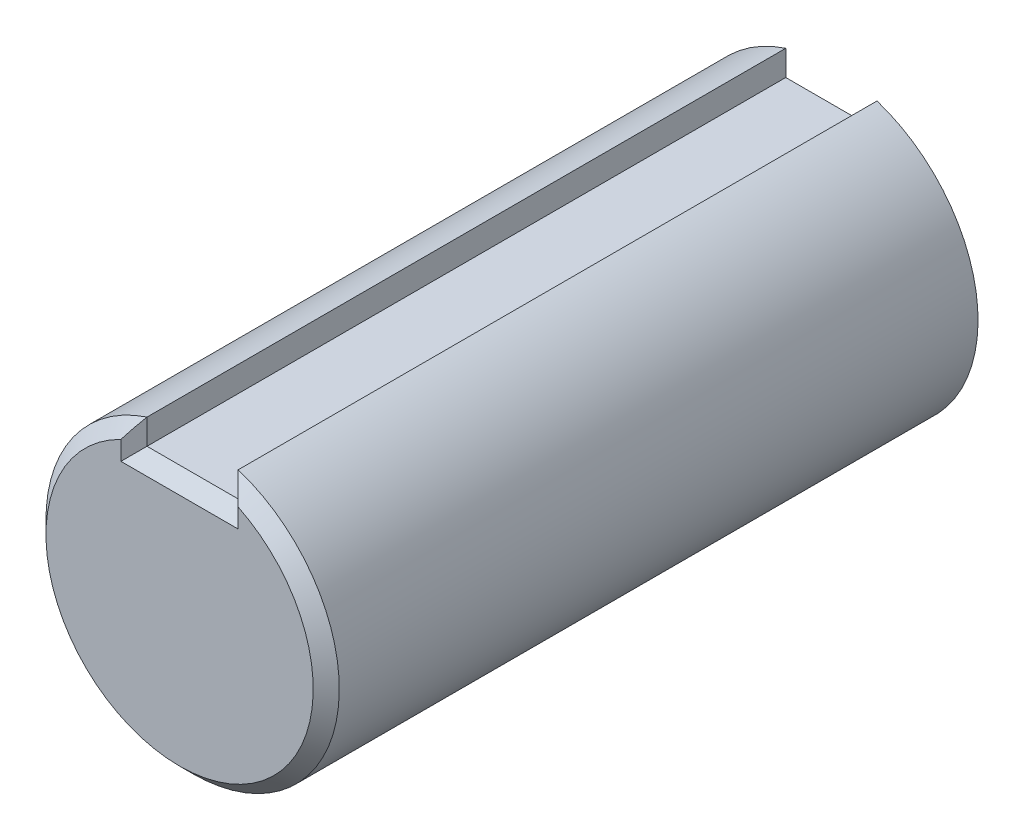
ISO-10303-21;
HEADER;
FILE_DESCRIPTION(('STEP AP214'),'2;1');
FILE_NAME('part.step','',(''),(''),'','','');
FILE_SCHEMA(('AUTOMOTIVE_DESIGN { 1 0 10303 214 1 1 1 1 }'));
ENDSEC;
DATA;
#1=APPLICATION_CONTEXT('core data for automotive mechanical design processes');
#2=APPLICATION_PROTOCOL_DEFINITION('international standard','automotive_design',2000,#1);
#3=PRODUCT_CONTEXT('',#1,'mechanical');
#4=PRODUCT('Part','Part','',(#3));
#5=PRODUCT_RELATED_PRODUCT_CATEGORY('part','',(#4));
#6=PRODUCT_DEFINITION_FORMATION('','',#4);
#7=PRODUCT_DEFINITION_CONTEXT('part definition',#1,'design');
#8=PRODUCT_DEFINITION('design','',#6,#7);
#9=PRODUCT_DEFINITION_SHAPE('','',#8);
#10=(LENGTH_UNIT() NAMED_UNIT(*) SI_UNIT(.MILLI.,.METRE.));
#11=(NAMED_UNIT(*) PLANE_ANGLE_UNIT() SI_UNIT($,.RADIAN.));
#12=(NAMED_UNIT(*) SI_UNIT($,.STERADIAN.) SOLID_ANGLE_UNIT());
#13=UNCERTAINTY_MEASURE_WITH_UNIT(LENGTH_MEASURE(1.E-05),#10,'distance_accuracy_value','');
#14=(GEOMETRIC_REPRESENTATION_CONTEXT(3) GLOBAL_UNCERTAINTY_ASSIGNED_CONTEXT((#13)) GLOBAL_UNIT_ASSIGNED_CONTEXT((#10,
#11,#12)) REPRESENTATION_CONTEXT('',''));
#15=CARTESIAN_POINT('',(0.,0.,0.));
#16=DIRECTION('',(0.,0.,1.));
#17=DIRECTION('',(1.,0.,0.));
#18=AXIS2_PLACEMENT_3D('',#15,#16,#17);
#19=CARTESIAN_POINT('',(0.,0.,100.));
#20=DIRECTION('',(0.,0.,-1.));
#21=DIRECTION('',(-1.,0.,0.));
#22=AXIS2_PLACEMENT_3D('',#19,#20,#21);
#23=CYLINDRICAL_SURFACE('',#22,22.5);
#24=DIRECTION('',(0.,0.,-1.));
#25=VECTOR('',#24,1.);
#26=CARTESIAN_POINT('',(7.,21.3834047803431,100.));
#27=LINE('',#26,#25);
#28=CARTESIAN_POINT('',(7.,21.3834047803431,0.));
#29=VERTEX_POINT('',#28);
#30=CARTESIAN_POINT('',(7.,21.3834047803431,98.));
#31=VERTEX_POINT('',#30);
#32=EDGE_CURVE('E116',#29,#31,#27,.F.);
#33=ORIENTED_EDGE('',*,*,#32,.T.);
#34=CARTESIAN_POINT('',(0.,0.,98.));
#35=DIRECTION('',(0.,0.,1.));
#36=DIRECTION('',(1.,0.,0.));
#37=AXIS2_PLACEMENT_3D('',#34,#35,#36);
#38=CIRCLE('',#37,22.5);
#39=CARTESIAN_POINT('',(-7.,21.3834047803431,98.));
#40=VERTEX_POINT('',#39);
#41=EDGE_CURVE('E153',#31,#40,#38,.F.);
#42=ORIENTED_EDGE('',*,*,#41,.T.);
#43=DIRECTION('',(0.,0.,-1.));
#44=VECTOR('',#43,1.);
#45=CARTESIAN_POINT('',(-7.,21.3834047803431,100.));
#46=LINE('',#45,#44);
#47=CARTESIAN_POINT('',(-7.,21.3834047803431,0.));
#48=VERTEX_POINT('',#47);
#49=EDGE_CURVE('E109',#40,#48,#46,.T.);
#50=ORIENTED_EDGE('',*,*,#49,.T.);
#51=CARTESIAN_POINT('',(0.,0.,0.));
#52=DIRECTION('',(0.,0.,1.));
#53=DIRECTION('',(1.,0.,0.));
#54=AXIS2_PLACEMENT_3D('',#51,#52,#53);
#55=CIRCLE('',#54,22.5);
#56=EDGE_CURVE('E135',#48,#29,#55,.T.);
#57=ORIENTED_EDGE('',*,*,#56,.T.);
#58=EDGE_LOOP('',(#33,#42,#50,#57));
#59=FACE_BOUND('',#58,.T.);
#60=ADVANCED_FACE('F47',(#59),#23,.T.);
#61=CARTESIAN_POINT('',(0.,0.,100.));
#62=DIRECTION('',(0.,0.,1.));
#63=DIRECTION('',(1.,0.,0.));
#64=AXIS2_PLACEMENT_3D('',#61,#62,#63);
#65=PLANE('',#64);
#66=DIRECTION('',(0.,1.,0.));
#67=VECTOR('',#66,1.);
#68=CARTESIAN_POINT('',(-8.99999999999999,21.3834047803431,100.));
#69=LINE('',#68,#67);
#70=CARTESIAN_POINT('',(-8.99999999999998,15.5,100.));
#71=VERTEX_POINT('',#70);
#72=CARTESIAN_POINT('',(-8.99999999999999,18.4187404563939,100.));
#73=VERTEX_POINT('',#72);
#74=EDGE_CURVE('E146',#71,#73,#69,.T.);
#75=ORIENTED_EDGE('',*,*,#74,.T.);
#76=CARTESIAN_POINT('',(0.,0.,100.));
#77=DIRECTION('',(0.,0.,1.));
#78=DIRECTION('',(1.,0.,0.));
#79=AXIS2_PLACEMENT_3D('',#76,#77,#78);
#80=CIRCLE('',#79,20.5);
#81=CARTESIAN_POINT('',(8.99999999999999,18.4187404563939,100.));
#82=VERTEX_POINT('',#81);
#83=EDGE_CURVE('E149',#73,#82,#80,.T.);
#84=ORIENTED_EDGE('',*,*,#83,.T.);
#85=DIRECTION('',(0.,-1.,0.));
#86=VECTOR('',#85,1.);
#87=CARTESIAN_POINT('',(8.99999999999999,17.5,100.));
#88=LINE('',#87,#86);
#89=CARTESIAN_POINT('',(8.99999999999999,15.5,100.));
#90=VERTEX_POINT('',#89);
#91=EDGE_CURVE('E140',#82,#90,#88,.T.);
#92=ORIENTED_EDGE('',*,*,#91,.T.);
#93=DIRECTION('',(-1.,0.,0.));
#94=VECTOR('',#93,1.);
#95=CARTESIAN_POINT('',(-7.,15.5,100.));
#96=LINE('',#95,#94);
#97=EDGE_CURVE('E143',#90,#71,#96,.T.);
#98=ORIENTED_EDGE('',*,*,#97,.T.);
#99=EDGE_LOOP('',(#75,#84,#92,#98));
#100=FACE_BOUND('',#99,.T.);
#101=ADVANCED_FACE('F202',(#100),#65,.T.);
#102=CARTESIAN_POINT('',(0.,0.,0.));
#103=DIRECTION('',(0.,0.,1.));
#104=DIRECTION('',(1.,0.,0.));
#105=AXIS2_PLACEMENT_3D('',#102,#103,#104);
#106=PLANE('',#105);
#107=DIRECTION('',(1.,0.,0.));
#108=VECTOR('',#107,1.);
#109=CARTESIAN_POINT('',(-7.,17.5,0.));
#110=LINE('',#109,#108);
#111=CARTESIAN_POINT('',(-7.,17.5,0.));
#112=VERTEX_POINT('',#111);
#113=CARTESIAN_POINT('',(7.,17.5,0.));
#114=VERTEX_POINT('',#113);
#115=EDGE_CURVE('E105',#112,#114,#110,.T.);
#116=ORIENTED_EDGE('',*,*,#115,.T.);
#117=DIRECTION('',(0.,1.,0.));
#118=VECTOR('',#117,1.);
#119=CARTESIAN_POINT('',(7.,26.3042375788311,0.));
#120=LINE('',#119,#118);
#121=EDGE_CURVE('E113',#114,#29,#120,.T.);
#122=ORIENTED_EDGE('',*,*,#121,.T.);
#123=ORIENTED_EDGE('',*,*,#56,.F.);
#124=DIRECTION('',(0.,-1.,0.));
#125=VECTOR('',#124,1.);
#126=CARTESIAN_POINT('',(-6.99999999999999,0.,0.));
#127=LINE('',#126,#125);
#128=EDGE_CURVE('E125',#48,#112,#127,.T.);
#129=ORIENTED_EDGE('',*,*,#128,.T.);
#130=EDGE_LOOP('',(#116,#122,#123,#129));
#131=FACE_BOUND('',#130,.T.);
#132=ADVANCED_FACE('F123',(#131),#106,.F.);
#133=CARTESIAN_POINT('',(7.,26.3042375788311,0.));
#134=DIRECTION('',(1.,0.,0.));
#135=DIRECTION('',(0.,1.,0.));
#136=AXIS2_PLACEMENT_3D('',#133,#134,#135);
#137=PLANE('',#136);
#138=DIRECTION('',(0.,0.,1.));
#139=VECTOR('',#138,1.);
#140=CARTESIAN_POINT('',(7.,17.5,0.));
#141=LINE('',#140,#139);
#142=CARTESIAN_POINT('',(7.,17.5,98.));
#143=VERTEX_POINT('',#142);
#144=EDGE_CURVE('E101',#114,#143,#141,.T.);
#145=ORIENTED_EDGE('',*,*,#144,.T.);
#146=DIRECTION('',(0.,1.,0.));
#147=VECTOR('',#146,1.);
#148=CARTESIAN_POINT('',(7.,21.3834047803431,98.));
#149=LINE('',#148,#147);
#150=EDGE_CURVE('E11',#143,#31,#149,.T.);
#151=ORIENTED_EDGE('',*,*,#150,.T.);
#152=ORIENTED_EDGE('',*,*,#32,.F.);
#153=ORIENTED_EDGE('',*,*,#121,.F.);
#154=EDGE_LOOP('',(#145,#151,#152,#153));
#155=FACE_BOUND('',#154,.T.);
#156=ADVANCED_FACE('F114',(#155),#137,.F.);
#157=CARTESIAN_POINT('',(-7.,26.3042375788311,0.));
#158=DIRECTION('',(-1.,0.,0.));
#159=DIRECTION('',(0.,-1.,0.));
#160=AXIS2_PLACEMENT_3D('',#157,#158,#159);
#161=PLANE('',#160);
#162=ORIENTED_EDGE('',*,*,#49,.F.);
#163=DIRECTION('',(0.,-1.,0.));
#164=VECTOR('',#163,1.);
#165=CARTESIAN_POINT('',(-7.,17.5,98.));
#166=LINE('',#165,#164);
#167=CARTESIAN_POINT('',(-7.,17.5,98.));
#168=VERTEX_POINT('',#167);
#169=EDGE_CURVE('E73',#40,#168,#166,.T.);
#170=ORIENTED_EDGE('',*,*,#169,.T.);
#171=DIRECTION('',(0.,0.,1.));
#172=VECTOR('',#171,1.);
#173=CARTESIAN_POINT('',(-7.,17.5,0.));
#174=LINE('',#173,#172);
#175=EDGE_CURVE('E110',#112,#168,#174,.T.);
#176=ORIENTED_EDGE('',*,*,#175,.F.);
#177=ORIENTED_EDGE('',*,*,#128,.F.);
#178=EDGE_LOOP('',(#162,#170,#176,#177));
#179=FACE_BOUND('',#178,.T.);
#180=ADVANCED_FACE('F214',(#179),#161,.F.);
#181=CARTESIAN_POINT('',(-7.,17.5,0.));
#182=DIRECTION('',(0.,-1.,0.));
#183=DIRECTION('',(0.,0.,-1.));
#184=AXIS2_PLACEMENT_3D('',#181,#182,#183);
#185=PLANE('',#184);
#186=ORIENTED_EDGE('',*,*,#175,.T.);
#187=DIRECTION('',(1.,0.,0.));
#188=VECTOR('',#187,1.);
#189=CARTESIAN_POINT('',(7.,17.5,98.));
#190=LINE('',#189,#188);
#191=EDGE_CURVE('E58',#168,#143,#190,.T.);
#192=ORIENTED_EDGE('',*,*,#191,.T.);
#193=ORIENTED_EDGE('',*,*,#144,.F.);
#194=ORIENTED_EDGE('',*,*,#115,.F.);
#195=EDGE_LOOP('',(#186,#192,#193,#194));
#196=FACE_BOUND('',#195,.T.);
#197=ADVANCED_FACE('F103',(#196),#185,.F.);
#198=CARTESIAN_POINT('',(-7.,17.5,98.));
#199=DIRECTION('',(0.,0.707106781186545,0.70710678118655));
#200=DIRECTION('',(-1.,0.,0.));
#201=AXIS2_PLACEMENT_3D('',#198,#199,#200);
#202=PLANE('',#201);
#203=DIRECTION('',(0.577350269189627,-0.577350269189627,0.577350269189623));
#204=VECTOR('',#203,1.);
#205=CARTESIAN_POINT('',(2.33333333333332,22.1666666666667,93.3333333333334));
#206=LINE('',#205,#204);
#207=EDGE_CURVE('E281',#143,#90,#206,.T.);
#208=ORIENTED_EDGE('',*,*,#207,.F.);
#209=ORIENTED_EDGE('',*,*,#191,.F.);
#210=DIRECTION('',(-0.577350269189627,-0.577350269189627,0.577350269189623));
#211=VECTOR('',#210,1.);
#212=CARTESIAN_POINT('',(-4.06525414038963,20.4347458596104,95.0652541403897));
#213=LINE('',#212,#211);
#214=EDGE_CURVE('E52',#71,#168,#213,.F.);
#215=ORIENTED_EDGE('',*,*,#214,.F.);
#216=ORIENTED_EDGE('',*,*,#97,.F.);
#217=EDGE_LOOP('',(#208,#209,#215,#216));
#218=FACE_BOUND('',#217,.T.);
#219=ADVANCED_FACE('F50',(#218),#202,.T.);
#220=CARTESIAN_POINT('',(-7.,26.3042375788311,98.));
#221=DIRECTION('',(0.707106781186545,0.,0.70710678118655));
#222=DIRECTION('',(0.,1.,0.));
#223=AXIS2_PLACEMENT_3D('',#220,#221,#222);
#224=PLANE('',#223);
#225=ORIENTED_EDGE('',*,*,#214,.T.);
#226=ORIENTED_EDGE('',*,*,#169,.F.);
#227=CARTESIAN_POINT('',(-7.,21.3834047803431,98.));
#228=CARTESIAN_POINT('',(-7.1728939886494,21.1448800837476,98.1728939886494));
#229=CARTESIAN_POINT('',(-7.34438346241136,20.904311132692,98.3443834624114));
#230=CARTESIAN_POINT('',(-7.68427902624381,20.4190215785597,98.6842790262438));
#231=CARTESIAN_POINT('',(-7.85268616174064,20.1743024394521,98.8526861617407));
#232=CARTESIAN_POINT('',(-8.18626943925745,19.6804744270975,99.1862694392575));
#233=CARTESIAN_POINT('',(-8.3514454471655,19.431365372454,99.3514454471655));
#234=CARTESIAN_POINT('',(-8.67837038920784,18.9285320638295,99.6783703892079));
#235=CARTESIAN_POINT('',(-8.84011811828094,18.6748062434148,99.840118118281));
#236=CARTESIAN_POINT('',(-8.99999999999998,18.4187404563939,100.));
#237=B_SPLINE_CURVE_WITH_KNOTS('',3,(#227,#228,#229,#230,#231,#232,#233,#234,#235,#236),
.UNSPECIFIED.,.F.,.F.,(4,2,2,2,4),(0.,1.02474416870168,2.04913408505375,3.07356643013604,
4.09835308979688),.UNSPECIFIED.);
#238=EDGE_CURVE('E170',#73,#40,#237,.F.);
#239=ORIENTED_EDGE('',*,*,#238,.F.);
#240=ORIENTED_EDGE('',*,*,#74,.F.);
#241=EDGE_LOOP('',(#225,#226,#239,#240));
#242=FACE_BOUND('',#241,.T.);
#243=ADVANCED_FACE('F187',(#242),#224,.T.);
#244=CARTESIAN_POINT('',(7.,26.3042375788311,98.));
#245=DIRECTION('',(-0.707106781186545,0.,0.70710678118655));
#246=DIRECTION('',(0.,-1.,0.));
#247=AXIS2_PLACEMENT_3D('',#244,#245,#246);
#248=PLANE('',#247);
#249=ORIENTED_EDGE('',*,*,#207,.T.);
#250=ORIENTED_EDGE('',*,*,#91,.F.);
#251=CARTESIAN_POINT('',(8.99999999999999,18.4187404563939,100.));
#252=CARTESIAN_POINT('',(8.84011811828094,18.6748062434148,99.8401181182809));
#253=CARTESIAN_POINT('',(8.67837038920784,18.9285320638295,99.6783703892079));
#254=CARTESIAN_POINT('',(8.35144544716551,19.431365372454,99.3514454471655));
#255=CARTESIAN_POINT('',(8.18626943925746,19.6804744270975,99.1862694392575));
#256=CARTESIAN_POINT('',(7.85268616174065,20.1743024394521,98.8526861617407));
#257=CARTESIAN_POINT('',(7.68427902624382,20.4190215785597,98.6842790262439));
#258=CARTESIAN_POINT('',(7.34438346241137,20.9043111326919,98.3443834624114));
#259=CARTESIAN_POINT('',(7.17289398864941,21.1448800837476,98.1728939886494));
#260=CARTESIAN_POINT('',(7.,21.3834047803431,98.));
#261=B_SPLINE_CURVE_WITH_KNOTS('',3,(#251,#252,#253,#254,#255,#256,#257,#258,#259,#260),
.UNSPECIFIED.,.F.,.F.,(4,2,2,2,4),(0.,1.02478665966085,2.04921900474312,3.07360892109519,
4.09835308979688),.UNSPECIFIED.);
#262=EDGE_CURVE('E161',#31,#82,#261,.F.);
#263=ORIENTED_EDGE('',*,*,#262,.F.);
#264=ORIENTED_EDGE('',*,*,#150,.F.);
#265=EDGE_LOOP('',(#249,#250,#263,#264));
#266=FACE_BOUND('',#265,.T.);
#267=ADVANCED_FACE('F176',(#266),#248,.T.);
#268=CARTESIAN_POINT('',(0.,0.,100.));
#269=DIRECTION('',(0.,0.,-1.));
#270=DIRECTION('',(-1.,0.,0.));
#271=AXIS2_PLACEMENT_3D('',#268,#269,#270);
#272=CONICAL_SURFACE('',#271,20.5,0.785398163397452);
#273=ORIENTED_EDGE('',*,*,#238,.T.);
#274=ORIENTED_EDGE('',*,*,#41,.F.);
#275=ORIENTED_EDGE('',*,*,#262,.T.);
#276=ORIENTED_EDGE('',*,*,#83,.F.);
#277=EDGE_LOOP('',(#273,#274,#275,#276));
#278=FACE_BOUND('',#277,.T.);
#279=ADVANCED_FACE('F180',(#278),#272,.T.);
#280=CLOSED_SHELL('',(#60,#101,#132,#156,#180,#197,#219,#243,#267,#279));
#281=MANIFOLD_SOLID_BREP('B2',#280);
#282=ADVANCED_BREP_SHAPE_REPRESENTATION('',(#18,#281),#14);
#283=SHAPE_DEFINITION_REPRESENTATION(#9,#282);
ENDSEC;
END-ISO-10303-21;
